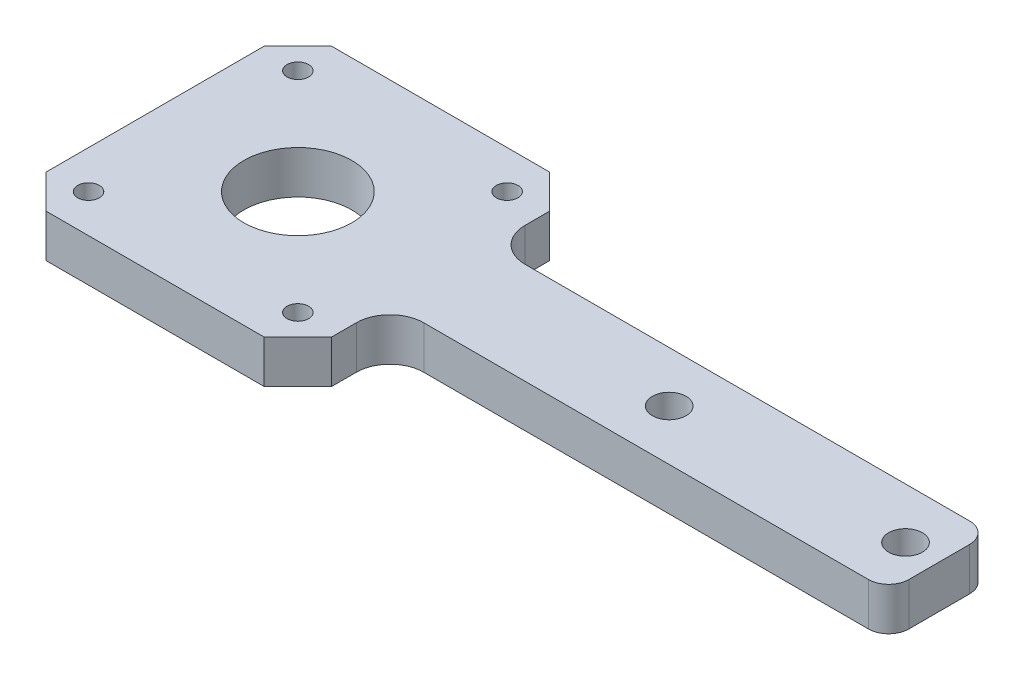
ISO-10303-21;
HEADER;
FILE_DESCRIPTION(('STEP AP214'),'2;1');
FILE_NAME('part.step','',(''),(''),'','','');
FILE_SCHEMA(('AUTOMOTIVE_DESIGN { 1 0 10303 214 1 1 1 1 }'));
ENDSEC;
DATA;
#1=APPLICATION_CONTEXT('core data for automotive mechanical design processes');
#2=APPLICATION_PROTOCOL_DEFINITION('international standard','automotive_design',2000,#1);
#3=PRODUCT_CONTEXT('',#1,'mechanical');
#4=PRODUCT('Part','Part','',(#3));
#5=PRODUCT_RELATED_PRODUCT_CATEGORY('part','',(#4));
#6=PRODUCT_DEFINITION_FORMATION('','',#4);
#7=PRODUCT_DEFINITION_CONTEXT('part definition',#1,'design');
#8=PRODUCT_DEFINITION('design','',#6,#7);
#9=PRODUCT_DEFINITION_SHAPE('','',#8);
#10=(LENGTH_UNIT() NAMED_UNIT(*) SI_UNIT(.MILLI.,.METRE.));
#11=(NAMED_UNIT(*) PLANE_ANGLE_UNIT() SI_UNIT($,.RADIAN.));
#12=(NAMED_UNIT(*) SI_UNIT($,.STERADIAN.) SOLID_ANGLE_UNIT());
#13=UNCERTAINTY_MEASURE_WITH_UNIT(LENGTH_MEASURE(1.E-05),#10,'distance_accuracy_value','');
#14=(GEOMETRIC_REPRESENTATION_CONTEXT(3) GLOBAL_UNCERTAINTY_ASSIGNED_CONTEXT((#13)) GLOBAL_UNIT_ASSIGNED_CONTEXT((#10,
#11,#12)) REPRESENTATION_CONTEXT('',''));
#15=CARTESIAN_POINT('',(0.,0.,0.));
#16=DIRECTION('',(0.,0.,1.));
#17=DIRECTION('',(1.,0.,0.));
#18=AXIS2_PLACEMENT_3D('',#15,#16,#17);
#19=CARTESIAN_POINT('',(0.,6.35,0.));
#20=DIRECTION('',(0.,1.,0.));
#21=DIRECTION('',(0.,0.,1.));
#22=AXIS2_PLACEMENT_3D('',#19,#20,#21);
#23=PLANE('',#22);
#24=CARTESIAN_POINT('',(90.,6.35,0.));
#25=DIRECTION('',(0.,1.,0.));
#26=DIRECTION('',(0.,0.,1.));
#27=AXIS2_PLACEMENT_3D('',#24,#25,#26);
#28=CIRCLE('',#27,2.5);
#29=CARTESIAN_POINT('',(90.,6.35,2.5));
#30=VERTEX_POINT('',#29);
#31=EDGE_CURVE('E317',#30,#30,#28,.T.);
#32=ORIENTED_EDGE('',*,*,#31,.F.);
#33=EDGE_LOOP('',(#32));
#34=FACE_BOUND('',#33,.T.);
#35=CARTESIAN_POINT('',(-15.5,6.35,15.5));
#36=DIRECTION('',(0.,1.,0.));
#37=DIRECTION('',(0.,0.,1.));
#38=AXIS2_PLACEMENT_3D('',#35,#36,#37);
#39=CIRCLE('',#38,1.6);
#40=CARTESIAN_POINT('',(-15.5,6.35,17.1));
#41=VERTEX_POINT('',#40);
#42=EDGE_CURVE('E305',#41,#41,#39,.T.);
#43=ORIENTED_EDGE('',*,*,#42,.F.);
#44=EDGE_LOOP('',(#43));
#45=FACE_BOUND('',#44,.T.);
#46=CARTESIAN_POINT('',(15.5,6.35,-15.5));
#47=DIRECTION('',(0.,1.,0.));
#48=DIRECTION('',(0.,0.,1.));
#49=AXIS2_PLACEMENT_3D('',#46,#47,#48);
#50=CIRCLE('',#49,1.6);
#51=CARTESIAN_POINT('',(15.5,6.35,-13.9));
#52=VERTEX_POINT('',#51);
#53=EDGE_CURVE('E293',#52,#52,#50,.T.);
#54=ORIENTED_EDGE('',*,*,#53,.F.);
#55=EDGE_LOOP('',(#54));
#56=FACE_BOUND('',#55,.T.);
#57=DIRECTION('',(0.,0.,-1.));
#58=VECTOR('',#57,1.);
#59=CARTESIAN_POINT('',(95.,6.35,-7.49999999999999));
#60=LINE('',#59,#58);
#61=CARTESIAN_POINT('',(95.,6.35,4.50000000000001));
#62=VERTEX_POINT('',#61);
#63=CARTESIAN_POINT('',(95.,6.35,-4.49999999999999));
#64=VERTEX_POINT('',#63);
#65=EDGE_CURVE('E285',#62,#64,#60,.T.);
#66=ORIENTED_EDGE('',*,*,#65,.T.);
#67=CARTESIAN_POINT('',(92.,6.35,-4.49999999999999));
#68=DIRECTION('',(0.,1.,0.));
#69=DIRECTION('',(0.,0.,1.));
#70=AXIS2_PLACEMENT_3D('',#67,#68,#69);
#71=CIRCLE('',#70,3.);
#72=CARTESIAN_POINT('',(92.,6.35,-7.49999999999999));
#73=VERTEX_POINT('',#72);
#74=EDGE_CURVE('E227',#64,#73,#71,.T.);
#75=ORIENTED_EDGE('',*,*,#74,.T.);
#76=DIRECTION('',(-1.,0.,0.));
#77=VECTOR('',#76,1.);
#78=CARTESIAN_POINT('',(21.15,6.35,-7.49999999999999));
#79=LINE('',#78,#77);
#80=CARTESIAN_POINT('',(26.15,6.35,-7.49999999999999));
#81=VERTEX_POINT('',#80);
#82=EDGE_CURVE('E252',#73,#81,#79,.T.);
#83=ORIENTED_EDGE('',*,*,#82,.T.);
#84=CARTESIAN_POINT('',(26.15,6.35,-12.5));
#85=DIRECTION('',(0.,1.,0.));
#86=DIRECTION('',(0.,0.,1.));
#87=AXIS2_PLACEMENT_3D('',#84,#85,#86);
#88=CIRCLE('',#87,5.);
#89=CARTESIAN_POINT('',(21.15,6.35,-12.5));
#90=VERTEX_POINT('',#89);
#91=EDGE_CURVE('E243',#81,#90,#88,.F.);
#92=ORIENTED_EDGE('',*,*,#91,.T.);
#93=DIRECTION('',(0.,0.,-1.));
#94=VECTOR('',#93,1.);
#95=CARTESIAN_POINT('',(21.15,6.35,-21.15));
#96=LINE('',#95,#94);
#97=CARTESIAN_POINT('',(21.15,6.35,-16.15));
#98=VERTEX_POINT('',#97);
#99=EDGE_CURVE('E250',#90,#98,#96,.T.);
#100=ORIENTED_EDGE('',*,*,#99,.T.);
#101=DIRECTION('',(0.707106781186547,0.,0.707106781186549));
#102=VECTOR('',#101,1.);
#103=CARTESIAN_POINT('',(18.65,6.35,-18.65));
#104=LINE('',#103,#102);
#105=CARTESIAN_POINT('',(16.15,6.35,-21.15));
#106=VERTEX_POINT('',#105);
#107=EDGE_CURVE('E197',#98,#106,#104,.F.);
#108=ORIENTED_EDGE('',*,*,#107,.T.);
#109=DIRECTION('',(-1.,0.,0.));
#110=VECTOR('',#109,1.);
#111=CARTESIAN_POINT('',(-21.15,6.35,-21.15));
#112=LINE('',#111,#110);
#113=CARTESIAN_POINT('',(-16.15,6.35,-21.15));
#114=VERTEX_POINT('',#113);
#115=EDGE_CURVE('E261',#106,#114,#112,.T.);
#116=ORIENTED_EDGE('',*,*,#115,.T.);
#117=DIRECTION('',(0.707106781186549,0.,-0.707106781186547));
#118=VECTOR('',#117,1.);
#119=CARTESIAN_POINT('',(-18.65,6.35,-18.65));
#120=LINE('',#119,#118);
#121=CARTESIAN_POINT('',(-21.15,6.35,-16.15));
#122=VERTEX_POINT('',#121);
#123=EDGE_CURVE('E199',#114,#122,#120,.F.);
#124=ORIENTED_EDGE('',*,*,#123,.T.);
#125=DIRECTION('',(0.,0.,1.));
#126=VECTOR('',#125,1.);
#127=CARTESIAN_POINT('',(-21.15,6.35,-21.15));
#128=LINE('',#127,#126);
#129=CARTESIAN_POINT('',(-21.15,6.35,16.15));
#130=VERTEX_POINT('',#129);
#131=EDGE_CURVE('E165',#122,#130,#128,.T.);
#132=ORIENTED_EDGE('',*,*,#131,.T.);
#133=DIRECTION('',(-0.707106781186547,0.,-0.707106781186549));
#134=VECTOR('',#133,1.);
#135=CARTESIAN_POINT('',(-18.65,6.35,18.65));
#136=LINE('',#135,#134);
#137=CARTESIAN_POINT('',(-16.15,6.35,21.15));
#138=VERTEX_POINT('',#137);
#139=EDGE_CURVE('E193',#130,#138,#136,.F.);
#140=ORIENTED_EDGE('',*,*,#139,.T.);
#141=DIRECTION('',(1.,0.,0.));
#142=VECTOR('',#141,1.);
#143=CARTESIAN_POINT('',(-21.15,6.35,21.15));
#144=LINE('',#143,#142);
#145=CARTESIAN_POINT('',(16.15,6.35,21.15));
#146=VERTEX_POINT('',#145);
#147=EDGE_CURVE('E183',#138,#146,#144,.T.);
#148=ORIENTED_EDGE('',*,*,#147,.T.);
#149=DIRECTION('',(-0.707106781186549,0.,0.707106781186547));
#150=VECTOR('',#149,1.);
#151=CARTESIAN_POINT('',(18.65,6.35,18.65));
#152=LINE('',#151,#150);
#153=CARTESIAN_POINT('',(21.15,6.35,16.15));
#154=VERTEX_POINT('',#153);
#155=EDGE_CURVE('E195',#146,#154,#152,.F.);
#156=ORIENTED_EDGE('',*,*,#155,.T.);
#157=DIRECTION('',(0.,0.,-1.));
#158=VECTOR('',#157,1.);
#159=CARTESIAN_POINT('',(21.15,6.35,7.50000000000001));
#160=LINE('',#159,#158);
#161=CARTESIAN_POINT('',(21.15,6.35,12.5));
#162=VERTEX_POINT('',#161);
#163=EDGE_CURVE('E177',#154,#162,#160,.T.);
#164=ORIENTED_EDGE('',*,*,#163,.T.);
#165=CARTESIAN_POINT('',(26.15,6.35,12.5));
#166=DIRECTION('',(0.,1.,0.));
#167=DIRECTION('',(0.,0.,1.));
#168=AXIS2_PLACEMENT_3D('',#165,#166,#167);
#169=CIRCLE('',#168,5.);
#170=CARTESIAN_POINT('',(26.15,6.35,7.50000000000001));
#171=VERTEX_POINT('',#170);
#172=EDGE_CURVE('E11',#162,#171,#169,.F.);
#173=ORIENTED_EDGE('',*,*,#172,.T.);
#174=DIRECTION('',(1.,0.,0.));
#175=VECTOR('',#174,1.);
#176=CARTESIAN_POINT('',(95.,6.35,7.50000000000001));
#177=LINE('',#176,#175);
#178=CARTESIAN_POINT('',(92.,6.35,7.50000000000001));
#179=VERTEX_POINT('',#178);
#180=EDGE_CURVE('E287',#171,#179,#177,.T.);
#181=ORIENTED_EDGE('',*,*,#180,.T.);
#182=CARTESIAN_POINT('',(92.,6.35,4.50000000000001));
#183=DIRECTION('',(0.,1.,0.));
#184=DIRECTION('',(0.,0.,1.));
#185=AXIS2_PLACEMENT_3D('',#182,#183,#184);
#186=CIRCLE('',#185,3.);
#187=EDGE_CURVE('E225',#179,#62,#186,.T.);
#188=ORIENTED_EDGE('',*,*,#187,.T.);
#189=EDGE_LOOP('',(#66,#75,#83,#92,#100,#108,#116,#124,#132,#140,#148,#156,#164,#173,#181,#188));
#190=FACE_BOUND('',#189,.T.);
#191=CARTESIAN_POINT('',(-15.5,6.35,-15.5));
#192=DIRECTION('',(0.,1.,0.));
#193=DIRECTION('',(0.,0.,1.));
#194=AXIS2_PLACEMENT_3D('',#191,#192,#193);
#195=CIRCLE('',#194,1.6);
#196=CARTESIAN_POINT('',(-15.5,6.35,-13.9));
#197=VERTEX_POINT('',#196);
#198=EDGE_CURVE('E278',#197,#197,#195,.T.);
#199=ORIENTED_EDGE('',*,*,#198,.F.);
#200=EDGE_LOOP('',(#199));
#201=FACE_BOUND('',#200,.T.);
#202=CARTESIAN_POINT('',(15.5,6.35,15.5));
#203=DIRECTION('',(0.,1.,0.));
#204=DIRECTION('',(0.,0.,1.));
#205=AXIS2_PLACEMENT_3D('',#202,#203,#204);
#206=CIRCLE('',#205,1.6);
#207=CARTESIAN_POINT('',(15.5,6.35,17.1));
#208=VERTEX_POINT('',#207);
#209=EDGE_CURVE('E299',#208,#208,#206,.T.);
#210=ORIENTED_EDGE('',*,*,#209,.F.);
#211=EDGE_LOOP('',(#210));
#212=FACE_BOUND('',#211,.T.);
#213=CARTESIAN_POINT('',(0.,6.35,0.));
#214=DIRECTION('',(0.,1.,0.));
#215=DIRECTION('',(0.,0.,1.));
#216=AXIS2_PLACEMENT_3D('',#213,#214,#215);
#217=CIRCLE('',#216,8.);
#218=CARTESIAN_POINT('',(0.,6.35,8.00000000000001));
#219=VERTEX_POINT('',#218);
#220=EDGE_CURVE('E311',#219,#219,#217,.T.);
#221=ORIENTED_EDGE('',*,*,#220,.F.);
#222=EDGE_LOOP('',(#221));
#223=FACE_BOUND('',#222,.T.);
#224=CARTESIAN_POINT('',(55.,6.35,0.));
#225=DIRECTION('',(0.,1.,0.));
#226=DIRECTION('',(0.,0.,1.));
#227=AXIS2_PLACEMENT_3D('',#224,#225,#226);
#228=CIRCLE('',#227,2.5);
#229=CARTESIAN_POINT('',(55.,6.35,2.50000000000001));
#230=VERTEX_POINT('',#229);
#231=EDGE_CURVE('E323',#230,#230,#228,.T.);
#232=ORIENTED_EDGE('',*,*,#231,.F.);
#233=EDGE_LOOP('',(#232));
#234=FACE_BOUND('',#233,.T.);
#235=ADVANCED_FACE('F33',(#34,#45,#56,#190,#201,#212,#223,#234),#23,.T.);
#236=CARTESIAN_POINT('',(0.,0.,0.));
#237=DIRECTION('',(0.,1.,0.));
#238=DIRECTION('',(0.,0.,1.));
#239=AXIS2_PLACEMENT_3D('',#236,#237,#238);
#240=PLANE('',#239);
#241=DIRECTION('',(-1.,0.,0.));
#242=VECTOR('',#241,1.);
#243=CARTESIAN_POINT('',(21.15,0.,-7.49999999999999));
#244=LINE('',#243,#242);
#245=CARTESIAN_POINT('',(92.,0.,-7.49999999999999));
#246=VERTEX_POINT('',#245);
#247=CARTESIAN_POINT('',(26.15,0.,-7.49999999999999));
#248=VERTEX_POINT('',#247);
#249=EDGE_CURVE('E265',#246,#248,#244,.T.);
#250=ORIENTED_EDGE('',*,*,#249,.F.);
#251=CARTESIAN_POINT('',(92.,0.,-4.49999999999999));
#252=DIRECTION('',(0.,1.,0.));
#253=DIRECTION('',(0.,0.,1.));
#254=AXIS2_PLACEMENT_3D('',#251,#252,#253);
#255=CIRCLE('',#254,3.);
#256=CARTESIAN_POINT('',(95.,0.,-4.49999999999999));
#257=VERTEX_POINT('',#256);
#258=EDGE_CURVE('E218',#246,#257,#255,.F.);
#259=ORIENTED_EDGE('',*,*,#258,.T.);
#260=DIRECTION('',(0.,0.,-1.));
#261=VECTOR('',#260,1.);
#262=CARTESIAN_POINT('',(95.,0.,-7.49999999999999));
#263=LINE('',#262,#261);
#264=CARTESIAN_POINT('',(95.,0.,4.50000000000001));
#265=VERTEX_POINT('',#264);
#266=EDGE_CURVE('E269',#265,#257,#263,.T.);
#267=ORIENTED_EDGE('',*,*,#266,.F.);
#268=CARTESIAN_POINT('',(92.,0.,4.50000000000001));
#269=DIRECTION('',(0.,1.,0.));
#270=DIRECTION('',(0.,0.,1.));
#271=AXIS2_PLACEMENT_3D('',#268,#269,#270);
#272=CIRCLE('',#271,3.);
#273=CARTESIAN_POINT('',(92.,0.,7.50000000000001));
#274=VERTEX_POINT('',#273);
#275=EDGE_CURVE('E215',#265,#274,#272,.F.);
#276=ORIENTED_EDGE('',*,*,#275,.T.);
#277=DIRECTION('',(1.,0.,0.));
#278=VECTOR('',#277,1.);
#279=CARTESIAN_POINT('',(95.,0.,7.50000000000001));
#280=LINE('',#279,#278);
#281=CARTESIAN_POINT('',(26.15,0.,7.50000000000001));
#282=VERTEX_POINT('',#281);
#283=EDGE_CURVE('E272',#282,#274,#280,.T.);
#284=ORIENTED_EDGE('',*,*,#283,.F.);
#285=CARTESIAN_POINT('',(26.15,0.,12.5));
#286=DIRECTION('',(0.,1.,0.));
#287=DIRECTION('',(0.,0.,1.));
#288=AXIS2_PLACEMENT_3D('',#285,#286,#287);
#289=CIRCLE('',#288,5.);
#290=CARTESIAN_POINT('',(21.15,0.,12.5));
#291=VERTEX_POINT('',#290);
#292=EDGE_CURVE('E41',#282,#291,#289,.T.);
#293=ORIENTED_EDGE('',*,*,#292,.T.);
#294=DIRECTION('',(0.,0.,-1.));
#295=VECTOR('',#294,1.);
#296=CARTESIAN_POINT('',(21.15,0.,7.50000000000001));
#297=LINE('',#296,#295);
#298=CARTESIAN_POINT('',(21.15,0.,16.15));
#299=VERTEX_POINT('',#298);
#300=EDGE_CURVE('E276',#299,#291,#297,.T.);
#301=ORIENTED_EDGE('',*,*,#300,.F.);
#302=DIRECTION('',(0.707106781186549,0.,-0.707106781186547));
#303=VECTOR('',#302,1.);
#304=CARTESIAN_POINT('',(21.15,0.,16.15));
#305=LINE('',#304,#303);
#306=CARTESIAN_POINT('',(16.15,0.,21.15));
#307=VERTEX_POINT('',#306);
#308=EDGE_CURVE('E186',#299,#307,#305,.F.);
#309=ORIENTED_EDGE('',*,*,#308,.T.);
#310=DIRECTION('',(1.,0.,0.));
#311=VECTOR('',#310,1.);
#312=CARTESIAN_POINT('',(-21.15,0.,21.15));
#313=LINE('',#312,#311);
#314=CARTESIAN_POINT('',(-16.15,0.,21.15));
#315=VERTEX_POINT('',#314);
#316=EDGE_CURVE('E173',#315,#307,#313,.T.);
#317=ORIENTED_EDGE('',*,*,#316,.F.);
#318=DIRECTION('',(0.707106781186547,0.,0.707106781186549));
#319=VECTOR('',#318,1.);
#320=CARTESIAN_POINT('',(-16.15,0.,21.15));
#321=LINE('',#320,#319);
#322=CARTESIAN_POINT('',(-21.15,0.,16.15));
#323=VERTEX_POINT('',#322);
#324=EDGE_CURVE('E166',#315,#323,#321,.F.);
#325=ORIENTED_EDGE('',*,*,#324,.T.);
#326=DIRECTION('',(0.,0.,1.));
#327=VECTOR('',#326,1.);
#328=CARTESIAN_POINT('',(-21.15,0.,-21.15));
#329=LINE('',#328,#327);
#330=CARTESIAN_POINT('',(-21.15,0.,-16.15));
#331=VERTEX_POINT('',#330);
#332=EDGE_CURVE('E162',#331,#323,#329,.T.);
#333=ORIENTED_EDGE('',*,*,#332,.F.);
#334=DIRECTION('',(-0.707106781186549,0.,0.707106781186547));
#335=VECTOR('',#334,1.);
#336=CARTESIAN_POINT('',(-21.15,0.,-16.15));
#337=LINE('',#336,#335);
#338=CARTESIAN_POINT('',(-16.15,0.,-21.15));
#339=VERTEX_POINT('',#338);
#340=EDGE_CURVE('E146',#331,#339,#337,.F.);
#341=ORIENTED_EDGE('',*,*,#340,.T.);
#342=DIRECTION('',(-1.,0.,0.));
#343=VECTOR('',#342,1.);
#344=CARTESIAN_POINT('',(-21.15,0.,-21.15));
#345=LINE('',#344,#343);
#346=CARTESIAN_POINT('',(16.15,0.,-21.15));
#347=VERTEX_POINT('',#346);
#348=EDGE_CURVE('E174',#347,#339,#345,.T.);
#349=ORIENTED_EDGE('',*,*,#348,.F.);
#350=DIRECTION('',(-0.707106781186547,0.,-0.707106781186549));
#351=VECTOR('',#350,1.);
#352=CARTESIAN_POINT('',(16.15,0.,-21.15));
#353=LINE('',#352,#351);
#354=CARTESIAN_POINT('',(21.15,0.,-16.15));
#355=VERTEX_POINT('',#354);
#356=EDGE_CURVE('E156',#347,#355,#353,.F.);
#357=ORIENTED_EDGE('',*,*,#356,.T.);
#358=DIRECTION('',(0.,0.,-1.));
#359=VECTOR('',#358,1.);
#360=CARTESIAN_POINT('',(21.15,0.,-21.15));
#361=LINE('',#360,#359);
#362=CARTESIAN_POINT('',(21.15,0.,-12.5));
#363=VERTEX_POINT('',#362);
#364=EDGE_CURVE('E179',#363,#355,#361,.T.);
#365=ORIENTED_EDGE('',*,*,#364,.F.);
#366=CARTESIAN_POINT('',(26.15,0.,-12.5));
#367=DIRECTION('',(0.,1.,0.));
#368=DIRECTION('',(0.,0.,1.));
#369=AXIS2_PLACEMENT_3D('',#366,#367,#368);
#370=CIRCLE('',#369,5.);
#371=EDGE_CURVE('E241',#363,#248,#370,.T.);
#372=ORIENTED_EDGE('',*,*,#371,.T.);
#373=EDGE_LOOP('',(#250,#259,#267,#276,#284,#293,#301,#309,#317,#325,#333,#341,#349,#357,#365,#372));
#374=FACE_BOUND('',#373,.T.);
#375=CARTESIAN_POINT('',(-15.5,0.,-15.5));
#376=DIRECTION('',(0.,1.,0.));
#377=DIRECTION('',(0.,0.,1.));
#378=AXIS2_PLACEMENT_3D('',#375,#376,#377);
#379=CIRCLE('',#378,1.6);
#380=CARTESIAN_POINT('',(-15.5,0.,-13.9));
#381=VERTEX_POINT('',#380);
#382=EDGE_CURVE('E290',#381,#381,#379,.T.);
#383=ORIENTED_EDGE('',*,*,#382,.T.);
#384=EDGE_LOOP('',(#383));
#385=FACE_BOUND('',#384,.T.);
#386=CARTESIAN_POINT('',(15.5,0.,-15.5));
#387=DIRECTION('',(0.,1.,0.));
#388=DIRECTION('',(0.,0.,1.));
#389=AXIS2_PLACEMENT_3D('',#386,#387,#388);
#390=CIRCLE('',#389,1.6);
#391=CARTESIAN_POINT('',(15.5,0.,-13.9));
#392=VERTEX_POINT('',#391);
#393=EDGE_CURVE('E296',#392,#392,#390,.T.);
#394=ORIENTED_EDGE('',*,*,#393,.T.);
#395=EDGE_LOOP('',(#394));
#396=FACE_BOUND('',#395,.T.);
#397=CARTESIAN_POINT('',(15.5,0.,15.5));
#398=DIRECTION('',(0.,1.,0.));
#399=DIRECTION('',(0.,0.,1.));
#400=AXIS2_PLACEMENT_3D('',#397,#398,#399);
#401=CIRCLE('',#400,1.6);
#402=CARTESIAN_POINT('',(15.5,0.,17.1));
#403=VERTEX_POINT('',#402);
#404=EDGE_CURVE('E302',#403,#403,#401,.T.);
#405=ORIENTED_EDGE('',*,*,#404,.T.);
#406=EDGE_LOOP('',(#405));
#407=FACE_BOUND('',#406,.T.);
#408=CARTESIAN_POINT('',(-15.5,0.,15.5));
#409=DIRECTION('',(0.,1.,0.));
#410=DIRECTION('',(0.,0.,1.));
#411=AXIS2_PLACEMENT_3D('',#408,#409,#410);
#412=CIRCLE('',#411,1.6);
#413=CARTESIAN_POINT('',(-15.5,0.,17.1));
#414=VERTEX_POINT('',#413);
#415=EDGE_CURVE('E308',#414,#414,#412,.T.);
#416=ORIENTED_EDGE('',*,*,#415,.T.);
#417=EDGE_LOOP('',(#416));
#418=FACE_BOUND('',#417,.T.);
#419=CARTESIAN_POINT('',(0.,0.,0.));
#420=DIRECTION('',(0.,1.,0.));
#421=DIRECTION('',(0.,0.,1.));
#422=AXIS2_PLACEMENT_3D('',#419,#420,#421);
#423=CIRCLE('',#422,8.);
#424=CARTESIAN_POINT('',(0.,0.,8.00000000000001));
#425=VERTEX_POINT('',#424);
#426=EDGE_CURVE('E314',#425,#425,#423,.T.);
#427=ORIENTED_EDGE('',*,*,#426,.T.);
#428=EDGE_LOOP('',(#427));
#429=FACE_BOUND('',#428,.T.);
#430=CARTESIAN_POINT('',(90.,0.,0.));
#431=DIRECTION('',(0.,1.,0.));
#432=DIRECTION('',(0.,0.,1.));
#433=AXIS2_PLACEMENT_3D('',#430,#431,#432);
#434=CIRCLE('',#433,2.5);
#435=CARTESIAN_POINT('',(90.,0.,2.5));
#436=VERTEX_POINT('',#435);
#437=EDGE_CURVE('E320',#436,#436,#434,.T.);
#438=ORIENTED_EDGE('',*,*,#437,.T.);
#439=EDGE_LOOP('',(#438));
#440=FACE_BOUND('',#439,.T.);
#441=CARTESIAN_POINT('',(55.,0.,0.));
#442=DIRECTION('',(0.,1.,0.));
#443=DIRECTION('',(0.,0.,1.));
#444=AXIS2_PLACEMENT_3D('',#441,#442,#443);
#445=CIRCLE('',#444,2.5);
#446=CARTESIAN_POINT('',(55.,0.,2.50000000000001));
#447=VERTEX_POINT('',#446);
#448=EDGE_CURVE('E326',#447,#447,#445,.T.);
#449=ORIENTED_EDGE('',*,*,#448,.T.);
#450=EDGE_LOOP('',(#449));
#451=FACE_BOUND('',#450,.T.);
#452=ADVANCED_FACE('F170',(#374,#385,#396,#407,#418,#429,#440,#451),#240,.F.);
#453=CARTESIAN_POINT('',(21.15,6.35,7.50000000000001));
#454=DIRECTION('',(-1.,0.,0.));
#455=DIRECTION('',(0.,0.,1.));
#456=AXIS2_PLACEMENT_3D('',#453,#454,#455);
#457=PLANE('',#456);
#458=ORIENTED_EDGE('',*,*,#300,.T.);
#459=DIRECTION('',(0.,-1.,0.));
#460=VECTOR('',#459,1.);
#461=CARTESIAN_POINT('',(21.15,6.35,12.5));
#462=LINE('',#461,#460);
#463=EDGE_CURVE('E54',#291,#162,#462,.F.);
#464=ORIENTED_EDGE('',*,*,#463,.T.);
#465=ORIENTED_EDGE('',*,*,#163,.F.);
#466=DIRECTION('',(0.,-1.,0.));
#467=VECTOR('',#466,1.);
#468=CARTESIAN_POINT('',(21.15,6.35,16.15));
#469=LINE('',#468,#467);
#470=EDGE_CURVE('E204',#154,#299,#469,.T.);
#471=ORIENTED_EDGE('',*,*,#470,.T.);
#472=EDGE_LOOP('',(#458,#464,#465,#471));
#473=FACE_BOUND('',#472,.T.);
#474=ADVANCED_FACE('F341',(#473),#457,.F.);
#475=CARTESIAN_POINT('',(95.,6.35,7.50000000000001));
#476=DIRECTION('',(0.,0.,-1.));
#477=DIRECTION('',(-1.,0.,0.));
#478=AXIS2_PLACEMENT_3D('',#475,#476,#477);
#479=PLANE('',#478);
#480=ORIENTED_EDGE('',*,*,#180,.F.);
#481=DIRECTION('',(0.,-1.,0.));
#482=VECTOR('',#481,1.);
#483=CARTESIAN_POINT('',(26.15,0.,7.50000000000001));
#484=LINE('',#483,#482);
#485=EDGE_CURVE('E237',#171,#282,#484,.T.);
#486=ORIENTED_EDGE('',*,*,#485,.T.);
#487=ORIENTED_EDGE('',*,*,#283,.T.);
#488=DIRECTION('',(0.,-1.,0.));
#489=VECTOR('',#488,1.);
#490=CARTESIAN_POINT('',(92.,6.35,7.50000000000001));
#491=LINE('',#490,#489);
#492=EDGE_CURVE('E229',#274,#179,#491,.F.);
#493=ORIENTED_EDGE('',*,*,#492,.T.);
#494=EDGE_LOOP('',(#480,#486,#487,#493));
#495=FACE_BOUND('',#494,.T.);
#496=ADVANCED_FACE('F366',(#495),#479,.F.);
#497=CARTESIAN_POINT('',(95.,6.35,-7.49999999999999));
#498=DIRECTION('',(-1.,0.,0.));
#499=DIRECTION('',(0.,0.,1.));
#500=AXIS2_PLACEMENT_3D('',#497,#498,#499);
#501=PLANE('',#500);
#502=ORIENTED_EDGE('',*,*,#266,.T.);
#503=DIRECTION('',(0.,-1.,0.));
#504=VECTOR('',#503,1.);
#505=CARTESIAN_POINT('',(95.,6.35,-4.49999999999999));
#506=LINE('',#505,#504);
#507=EDGE_CURVE('E223',#257,#64,#506,.F.);
#508=ORIENTED_EDGE('',*,*,#507,.T.);
#509=ORIENTED_EDGE('',*,*,#65,.F.);
#510=DIRECTION('',(0.,-1.,0.));
#511=VECTOR('',#510,1.);
#512=CARTESIAN_POINT('',(95.,6.35,4.50000000000001));
#513=LINE('',#512,#511);
#514=EDGE_CURVE('E220',#62,#265,#513,.T.);
#515=ORIENTED_EDGE('',*,*,#514,.T.);
#516=EDGE_LOOP('',(#502,#508,#509,#515));
#517=FACE_BOUND('',#516,.T.);
#518=ADVANCED_FACE('F363',(#517),#501,.F.);
#519=CARTESIAN_POINT('',(21.15,6.35,-7.49999999999999));
#520=DIRECTION('',(0.,0.,1.));
#521=DIRECTION('',(1.,0.,0.));
#522=AXIS2_PLACEMENT_3D('',#519,#520,#521);
#523=PLANE('',#522);
#524=ORIENTED_EDGE('',*,*,#249,.T.);
#525=DIRECTION('',(0.,-1.,0.));
#526=VECTOR('',#525,1.);
#527=CARTESIAN_POINT('',(26.15,6.35,-7.49999999999999));
#528=LINE('',#527,#526);
#529=EDGE_CURVE('E235',#248,#81,#528,.F.);
#530=ORIENTED_EDGE('',*,*,#529,.T.);
#531=ORIENTED_EDGE('',*,*,#82,.F.);
#532=DIRECTION('',(0.,-1.,0.));
#533=VECTOR('',#532,1.);
#534=CARTESIAN_POINT('',(92.,6.35,-7.49999999999999));
#535=LINE('',#534,#533);
#536=EDGE_CURVE('E212',#73,#246,#535,.T.);
#537=ORIENTED_EDGE('',*,*,#536,.T.);
#538=EDGE_LOOP('',(#524,#530,#531,#537));
#539=FACE_BOUND('',#538,.T.);
#540=ADVANCED_FACE('F267',(#539),#523,.F.);
#541=CARTESIAN_POINT('',(21.15,6.35,-21.15));
#542=DIRECTION('',(-1.,0.,0.));
#543=DIRECTION('',(0.,0.,1.));
#544=AXIS2_PLACEMENT_3D('',#541,#542,#543);
#545=PLANE('',#544);
#546=ORIENTED_EDGE('',*,*,#99,.F.);
#547=DIRECTION('',(0.,-1.,0.));
#548=VECTOR('',#547,1.);
#549=CARTESIAN_POINT('',(21.15,0.,-12.5));
#550=LINE('',#549,#548);
#551=EDGE_CURVE('E232',#90,#363,#550,.T.);
#552=ORIENTED_EDGE('',*,*,#551,.T.);
#553=ORIENTED_EDGE('',*,*,#364,.T.);
#554=DIRECTION('',(0.,1.,0.));
#555=VECTOR('',#554,1.);
#556=CARTESIAN_POINT('',(21.15,6.35,-16.15));
#557=LINE('',#556,#555);
#558=EDGE_CURVE('E201',#355,#98,#557,.T.);
#559=ORIENTED_EDGE('',*,*,#558,.T.);
#560=EDGE_LOOP('',(#546,#552,#553,#559));
#561=FACE_BOUND('',#560,.T.);
#562=ADVANCED_FACE('F257',(#561),#545,.F.);
#563=CARTESIAN_POINT('',(-21.15,6.35,-21.15));
#564=DIRECTION('',(0.,0.,1.));
#565=DIRECTION('',(1.,0.,0.));
#566=AXIS2_PLACEMENT_3D('',#563,#564,#565);
#567=PLANE('',#566);
#568=ORIENTED_EDGE('',*,*,#348,.T.);
#569=DIRECTION('',(0.,1.,0.));
#570=VECTOR('',#569,1.);
#571=CARTESIAN_POINT('',(-16.15,6.35,-21.15));
#572=LINE('',#571,#570);
#573=EDGE_CURVE('E151',#339,#114,#572,.T.);
#574=ORIENTED_EDGE('',*,*,#573,.T.);
#575=ORIENTED_EDGE('',*,*,#115,.F.);
#576=DIRECTION('',(0.,-1.,0.));
#577=VECTOR('',#576,1.);
#578=CARTESIAN_POINT('',(16.15,6.35,-21.15));
#579=LINE('',#578,#577);
#580=EDGE_CURVE('E155',#106,#347,#579,.T.);
#581=ORIENTED_EDGE('',*,*,#580,.T.);
#582=EDGE_LOOP('',(#568,#574,#575,#581));
#583=FACE_BOUND('',#582,.T.);
#584=ADVANCED_FACE('F355',(#583),#567,.F.);
#585=CARTESIAN_POINT('',(-21.15,6.35,-21.15));
#586=DIRECTION('',(1.,0.,0.));
#587=DIRECTION('',(0.,0.,-1.));
#588=AXIS2_PLACEMENT_3D('',#585,#586,#587);
#589=PLANE('',#588);
#590=ORIENTED_EDGE('',*,*,#131,.F.);
#591=DIRECTION('',(0.,-1.,0.));
#592=VECTOR('',#591,1.);
#593=CARTESIAN_POINT('',(-21.15,6.35,-16.15));
#594=LINE('',#593,#592);
#595=EDGE_CURVE('E150',#122,#331,#594,.T.);
#596=ORIENTED_EDGE('',*,*,#595,.T.);
#597=ORIENTED_EDGE('',*,*,#332,.T.);
#598=DIRECTION('',(0.,1.,0.));
#599=VECTOR('',#598,1.);
#600=CARTESIAN_POINT('',(-21.15,6.35,16.15));
#601=LINE('',#600,#599);
#602=EDGE_CURVE('E167',#323,#130,#601,.T.);
#603=ORIENTED_EDGE('',*,*,#602,.T.);
#604=EDGE_LOOP('',(#590,#596,#597,#603));
#605=FACE_BOUND('',#604,.T.);
#606=ADVANCED_FACE('F161',(#605),#589,.F.);
#607=CARTESIAN_POINT('',(-21.15,6.35,21.15));
#608=DIRECTION('',(0.,0.,-1.));
#609=DIRECTION('',(-1.,0.,0.));
#610=AXIS2_PLACEMENT_3D('',#607,#608,#609);
#611=PLANE('',#610);
#612=ORIENTED_EDGE('',*,*,#316,.T.);
#613=DIRECTION('',(0.,1.,0.));
#614=VECTOR('',#613,1.);
#615=CARTESIAN_POINT('',(16.15,6.35,21.15));
#616=LINE('',#615,#614);
#617=EDGE_CURVE('E210',#307,#146,#616,.T.);
#618=ORIENTED_EDGE('',*,*,#617,.T.);
#619=ORIENTED_EDGE('',*,*,#147,.F.);
#620=DIRECTION('',(0.,-1.,0.));
#621=VECTOR('',#620,1.);
#622=CARTESIAN_POINT('',(-16.15,6.35,21.15));
#623=LINE('',#622,#621);
#624=EDGE_CURVE('E207',#138,#315,#623,.T.);
#625=ORIENTED_EDGE('',*,*,#624,.T.);
#626=EDGE_LOOP('',(#612,#618,#619,#625));
#627=FACE_BOUND('',#626,.T.);
#628=ADVANCED_FACE('F349',(#627),#611,.F.);
#629=CARTESIAN_POINT('',(-15.5,6.35,-15.5));
#630=DIRECTION('',(0.,-1.,0.));
#631=DIRECTION('',(0.,0.,-1.));
#632=AXIS2_PLACEMENT_3D('',#629,#630,#631);
#633=CYLINDRICAL_SURFACE('',#632,1.6);
#634=ORIENTED_EDGE('',*,*,#198,.T.);
#635=EDGE_LOOP('',(#634));
#636=FACE_BOUND('',#635,.T.);
#637=ORIENTED_EDGE('',*,*,#382,.F.);
#638=EDGE_LOOP('',(#637));
#639=FACE_BOUND('',#638,.T.);
#640=ADVANCED_FACE('F346',(#636,#639),#633,.F.);
#641=CARTESIAN_POINT('',(15.5,6.35,-15.5));
#642=DIRECTION('',(0.,-1.,0.));
#643=DIRECTION('',(0.,0.,-1.));
#644=AXIS2_PLACEMENT_3D('',#641,#642,#643);
#645=CYLINDRICAL_SURFACE('',#644,1.6);
#646=ORIENTED_EDGE('',*,*,#53,.T.);
#647=EDGE_LOOP('',(#646));
#648=FACE_BOUND('',#647,.T.);
#649=ORIENTED_EDGE('',*,*,#393,.F.);
#650=EDGE_LOOP('',(#649));
#651=FACE_BOUND('',#650,.T.);
#652=ADVANCED_FACE('F567',(#648,#651),#645,.F.);
#653=CARTESIAN_POINT('',(15.5,6.35,15.5));
#654=DIRECTION('',(0.,-1.,0.));
#655=DIRECTION('',(0.,0.,-1.));
#656=AXIS2_PLACEMENT_3D('',#653,#654,#655);
#657=CYLINDRICAL_SURFACE('',#656,1.6);
#658=ORIENTED_EDGE('',*,*,#209,.T.);
#659=EDGE_LOOP('',(#658));
#660=FACE_BOUND('',#659,.T.);
#661=ORIENTED_EDGE('',*,*,#404,.F.);
#662=EDGE_LOOP('',(#661));
#663=FACE_BOUND('',#662,.T.);
#664=ADVANCED_FACE('F557',(#660,#663),#657,.F.);
#665=CARTESIAN_POINT('',(-15.5,6.35,15.5));
#666=DIRECTION('',(0.,-1.,0.));
#667=DIRECTION('',(0.,0.,-1.));
#668=AXIS2_PLACEMENT_3D('',#665,#666,#667);
#669=CYLINDRICAL_SURFACE('',#668,1.6);
#670=ORIENTED_EDGE('',*,*,#42,.T.);
#671=EDGE_LOOP('',(#670));
#672=FACE_BOUND('',#671,.T.);
#673=ORIENTED_EDGE('',*,*,#415,.F.);
#674=EDGE_LOOP('',(#673));
#675=FACE_BOUND('',#674,.T.);
#676=ADVANCED_FACE('F547',(#672,#675),#669,.F.);
#677=CARTESIAN_POINT('',(0.,6.35,0.));
#678=DIRECTION('',(0.,-1.,0.));
#679=DIRECTION('',(0.,0.,-1.));
#680=AXIS2_PLACEMENT_3D('',#677,#678,#679);
#681=CYLINDRICAL_SURFACE('',#680,8.);
#682=ORIENTED_EDGE('',*,*,#220,.T.);
#683=EDGE_LOOP('',(#682));
#684=FACE_BOUND('',#683,.T.);
#685=ORIENTED_EDGE('',*,*,#426,.F.);
#686=EDGE_LOOP('',(#685));
#687=FACE_BOUND('',#686,.T.);
#688=ADVANCED_FACE('F537',(#684,#687),#681,.F.);
#689=CARTESIAN_POINT('',(90.,6.35,0.));
#690=DIRECTION('',(0.,-1.,0.));
#691=DIRECTION('',(0.,0.,-1.));
#692=AXIS2_PLACEMENT_3D('',#689,#690,#691);
#693=CYLINDRICAL_SURFACE('',#692,2.5);
#694=ORIENTED_EDGE('',*,*,#31,.T.);
#695=EDGE_LOOP('',(#694));
#696=FACE_BOUND('',#695,.T.);
#697=ORIENTED_EDGE('',*,*,#437,.F.);
#698=EDGE_LOOP('',(#697));
#699=FACE_BOUND('',#698,.T.);
#700=ADVANCED_FACE('F528',(#696,#699),#693,.F.);
#701=CARTESIAN_POINT('',(55.,6.35,0.));
#702=DIRECTION('',(0.,-1.,0.));
#703=DIRECTION('',(0.,0.,-1.));
#704=AXIS2_PLACEMENT_3D('',#701,#702,#703);
#705=CYLINDRICAL_SURFACE('',#704,2.5);
#706=ORIENTED_EDGE('',*,*,#231,.T.);
#707=EDGE_LOOP('',(#706));
#708=FACE_BOUND('',#707,.T.);
#709=ORIENTED_EDGE('',*,*,#448,.F.);
#710=EDGE_LOOP('',(#709));
#711=FACE_BOUND('',#710,.T.);
#712=ADVANCED_FACE('F332',(#708,#711),#705,.F.);
#713=CARTESIAN_POINT('',(-21.15,6.35,-16.15));
#714=DIRECTION('',(0.707106781186546,0.,0.707106781186548));
#715=DIRECTION('',(0.,-1.,0.));
#716=AXIS2_PLACEMENT_3D('',#713,#714,#715);
#717=PLANE('',#716);
#718=ORIENTED_EDGE('',*,*,#123,.F.);
#719=ORIENTED_EDGE('',*,*,#573,.F.);
#720=ORIENTED_EDGE('',*,*,#340,.F.);
#721=ORIENTED_EDGE('',*,*,#595,.F.);
#722=EDGE_LOOP('',(#718,#719,#720,#721));
#723=FACE_BOUND('',#722,.T.);
#724=ADVANCED_FACE('F149',(#723),#717,.F.);
#725=CARTESIAN_POINT('',(16.15,6.35,-21.15));
#726=DIRECTION('',(-0.707106781186549,0.,0.707106781186547));
#727=DIRECTION('',(0.,-1.,0.));
#728=AXIS2_PLACEMENT_3D('',#725,#726,#727);
#729=PLANE('',#728);
#730=ORIENTED_EDGE('',*,*,#107,.F.);
#731=ORIENTED_EDGE('',*,*,#558,.F.);
#732=ORIENTED_EDGE('',*,*,#356,.F.);
#733=ORIENTED_EDGE('',*,*,#580,.F.);
#734=EDGE_LOOP('',(#730,#731,#732,#733));
#735=FACE_BOUND('',#734,.T.);
#736=ADVANCED_FACE('F375',(#735),#729,.F.);
#737=CARTESIAN_POINT('',(21.15,6.35,16.15));
#738=DIRECTION('',(-0.707106781186546,0.,-0.707106781186548));
#739=DIRECTION('',(0.,-1.,0.));
#740=AXIS2_PLACEMENT_3D('',#737,#738,#739);
#741=PLANE('',#740);
#742=ORIENTED_EDGE('',*,*,#155,.F.);
#743=ORIENTED_EDGE('',*,*,#617,.F.);
#744=ORIENTED_EDGE('',*,*,#308,.F.);
#745=ORIENTED_EDGE('',*,*,#470,.F.);
#746=EDGE_LOOP('',(#742,#743,#744,#745));
#747=FACE_BOUND('',#746,.T.);
#748=ADVANCED_FACE('F378',(#747),#741,.F.);
#749=CARTESIAN_POINT('',(-16.15,6.35,21.15));
#750=DIRECTION('',(0.707106781186548,0.,-0.707106781186546));
#751=DIRECTION('',(0.,-1.,0.));
#752=AXIS2_PLACEMENT_3D('',#749,#750,#751);
#753=PLANE('',#752);
#754=ORIENTED_EDGE('',*,*,#139,.F.);
#755=ORIENTED_EDGE('',*,*,#602,.F.);
#756=ORIENTED_EDGE('',*,*,#324,.F.);
#757=ORIENTED_EDGE('',*,*,#624,.F.);
#758=EDGE_LOOP('',(#754,#755,#756,#757));
#759=FACE_BOUND('',#758,.T.);
#760=ADVANCED_FACE('F382',(#759),#753,.F.);
#761=CARTESIAN_POINT('',(92.,6.35,-4.49999999999999));
#762=DIRECTION('',(0.,-1.,0.));
#763=DIRECTION('',(0.,0.,-1.));
#764=AXIS2_PLACEMENT_3D('',#761,#762,#763);
#765=CYLINDRICAL_SURFACE('',#764,3.);
#766=ORIENTED_EDGE('',*,*,#74,.F.);
#767=ORIENTED_EDGE('',*,*,#507,.F.);
#768=ORIENTED_EDGE('',*,*,#258,.F.);
#769=ORIENTED_EDGE('',*,*,#536,.F.);
#770=EDGE_LOOP('',(#766,#767,#768,#769));
#771=FACE_BOUND('',#770,.T.);
#772=ADVANCED_FACE('F386',(#771),#765,.T.);
#773=CARTESIAN_POINT('',(92.,6.35,4.50000000000001));
#774=DIRECTION('',(0.,-1.,0.));
#775=DIRECTION('',(0.,0.,-1.));
#776=AXIS2_PLACEMENT_3D('',#773,#774,#775);
#777=CYLINDRICAL_SURFACE('',#776,3.);
#778=ORIENTED_EDGE('',*,*,#187,.F.);
#779=ORIENTED_EDGE('',*,*,#492,.F.);
#780=ORIENTED_EDGE('',*,*,#275,.F.);
#781=ORIENTED_EDGE('',*,*,#514,.F.);
#782=EDGE_LOOP('',(#778,#779,#780,#781));
#783=FACE_BOUND('',#782,.T.);
#784=ADVANCED_FACE('F390',(#783),#777,.T.);
#785=CARTESIAN_POINT('',(26.15,6.35,-12.5));
#786=DIRECTION('',(0.,1.,0.));
#787=DIRECTION('',(0.,0.,1.));
#788=AXIS2_PLACEMENT_3D('',#785,#786,#787);
#789=CYLINDRICAL_SURFACE('',#788,5.);
#790=ORIENTED_EDGE('',*,*,#91,.F.);
#791=ORIENTED_EDGE('',*,*,#529,.F.);
#792=ORIENTED_EDGE('',*,*,#371,.F.);
#793=ORIENTED_EDGE('',*,*,#551,.F.);
#794=EDGE_LOOP('',(#790,#791,#792,#793));
#795=FACE_BOUND('',#794,.T.);
#796=ADVANCED_FACE('F263',(#795),#789,.F.);
#797=CARTESIAN_POINT('',(26.15,6.35,12.5));
#798=DIRECTION('',(0.,1.,0.));
#799=DIRECTION('',(0.,0.,1.));
#800=AXIS2_PLACEMENT_3D('',#797,#798,#799);
#801=CYLINDRICAL_SURFACE('',#800,5.);
#802=ORIENTED_EDGE('',*,*,#172,.F.);
#803=ORIENTED_EDGE('',*,*,#463,.F.);
#804=ORIENTED_EDGE('',*,*,#292,.F.);
#805=ORIENTED_EDGE('',*,*,#485,.F.);
#806=EDGE_LOOP('',(#802,#803,#804,#805));
#807=FACE_BOUND('',#806,.T.);
#808=ADVANCED_FACE('F35',(#807),#801,.F.);
#809=CLOSED_SHELL('',(#235,#452,#474,#496,#518,#540,#562,#584,#606,#628,#640,#652,#664,#676,
#688,#700,#712,#724,#736,#748,#760,#772,#784,#796,#808));
#810=MANIFOLD_SOLID_BREP('B2',#809);
#811=ADVANCED_BREP_SHAPE_REPRESENTATION('',(#18,#810),#14);
#812=SHAPE_DEFINITION_REPRESENTATION(#9,#811);
ENDSEC;
END-ISO-10303-21;
